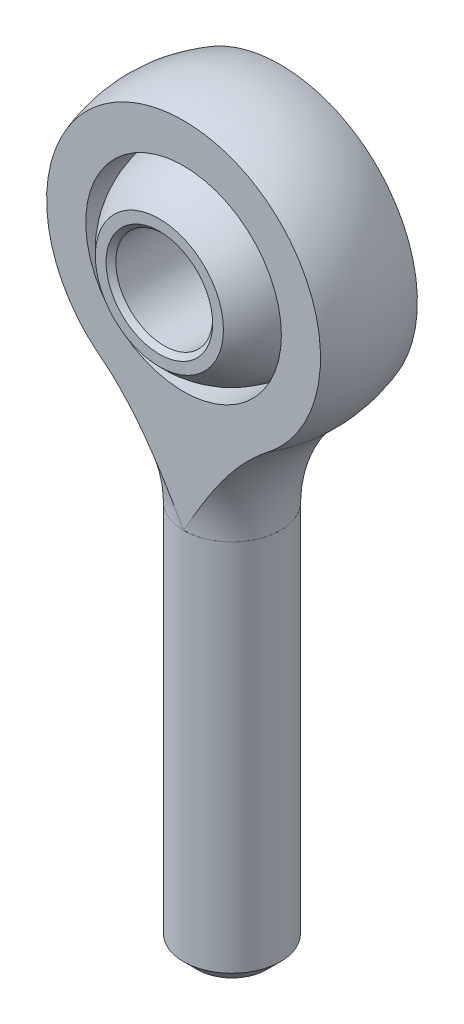
ISO-10303-21;
HEADER;
FILE_DESCRIPTION(('STEP AP214'),'2;1');
FILE_NAME('part.step','',(''),(''),'','','');
FILE_SCHEMA(('AUTOMOTIVE_DESIGN { 1 0 10303 214 1 1 1 1 }'));
ENDSEC;
DATA;
#1=APPLICATION_CONTEXT('core data for automotive mechanical design processes');
#2=APPLICATION_PROTOCOL_DEFINITION('international standard','automotive_design',2000,#1);
#3=PRODUCT_CONTEXT('',#1,'mechanical');
#4=PRODUCT('Part','Part','',(#3));
#5=PRODUCT_RELATED_PRODUCT_CATEGORY('part','',(#4));
#6=PRODUCT_DEFINITION_FORMATION('','',#4);
#7=PRODUCT_DEFINITION_CONTEXT('part definition',#1,'design');
#8=PRODUCT_DEFINITION('design','',#6,#7);
#9=PRODUCT_DEFINITION_SHAPE('','',#8);
#10=(LENGTH_UNIT() NAMED_UNIT(*) SI_UNIT(.MILLI.,.METRE.));
#11=(NAMED_UNIT(*) PLANE_ANGLE_UNIT() SI_UNIT($,.RADIAN.));
#12=(NAMED_UNIT(*) SI_UNIT($,.STERADIAN.) SOLID_ANGLE_UNIT());
#13=UNCERTAINTY_MEASURE_WITH_UNIT(LENGTH_MEASURE(1.E-05),#10,'distance_accuracy_value','');
#14=(GEOMETRIC_REPRESENTATION_CONTEXT(3) GLOBAL_UNCERTAINTY_ASSIGNED_CONTEXT((#13)) GLOBAL_UNIT_ASSIGNED_CONTEXT((#10,
#11,#12)) REPRESENTATION_CONTEXT('',''));
#15=CARTESIAN_POINT('',(0.,0.,0.));
#16=DIRECTION('',(0.,0.,1.));
#17=DIRECTION('',(1.,0.,0.));
#18=AXIS2_PLACEMENT_3D('',#15,#16,#17);
#19=CARTESIAN_POINT('',(0.,0.,0.));
#20=DIRECTION('',(0.,1.,0.));
#21=DIRECTION('',(-1.,0.,0.));
#22=AXIS2_PLACEMENT_3D('',#19,#20,#21);
#23=TOROIDAL_SURFACE('',#22,12.8984375,9.72343749999999);
#24=CARTESIAN_POINT('',(0.,0.,0.));
#25=DIRECTION('',(0.,-1.,0.));
#26=DIRECTION('',(-1.,0.,0.));
#27=AXIS2_PLACEMENT_3D('',#24,#25,#26);
#28=CIRCLE('',#27,3.175);
#29=CARTESIAN_POINT('',(0.,0.,-3.175));
#30=VERTEX_POINT('',#29);
#31=CARTESIAN_POINT('',(0.,0.,3.175));
#32=VERTEX_POINT('',#31);
#33=EDGE_CURVE('E111',#30,#32,#28,.T.);
#34=ORIENTED_EDGE('',*,*,#33,.F.);
#35=CARTESIAN_POINT('',(0.,0.,-3.175));
#36=CARTESIAN_POINT('',(0.00326153280968916,0.00570768458301649,-3.17500000000001));
#37=CARTESIAN_POINT('',(0.00652306727318909,0.0114153698475898,-3.17500000000001));
#38=CARTESIAN_POINT('',(0.273129494139749,0.477974240370057,-3.17500000000025));
#39=CARTESIAN_POINT('',(0.536560192577593,0.938786382512307,-3.17500000000008));
#40=CARTESIAN_POINT('',(1.07566265444661,1.85322785393754,-3.17499999999995));
#41=CARTESIAN_POINT('',(1.35133223121798,2.30685844682153,-3.17499999999999));
#42=CARTESIAN_POINT('',(1.92559609434366,3.19894900717051,-3.17500000000003));
#43=CARTESIAN_POINT('',(2.22416629491579,3.63742422869272,-3.17500000000001));
#44=CARTESIAN_POINT('',(2.85309895627944,4.49102276266281,-3.17500000000001));
#45=CARTESIAN_POINT('',(3.18344395161558,4.90615870726445,-3.17500000000001));
#46=CARTESIAN_POINT('',(3.77466960907839,5.58162755342156,-3.17500000000001));
#47=CARTESIAN_POINT('',(4.02585009153859,5.85044049906379,-3.17500000000001));
#48=CARTESIAN_POINT('',(4.54711374409417,6.36901465418585,-3.17500000000001));
#49=CARTESIAN_POINT('',(4.8171908835523,6.61878188917193,-3.17500000000001));
#50=CARTESIAN_POINT('',(5.37662445733852,7.09612768081782,-3.17500000000001));
#51=CARTESIAN_POINT('',(5.66599147543084,7.32369388495056,-3.17500000000001));
#52=CARTESIAN_POINT('',(6.26322715757394,7.75319037761747,-3.17500000000001));
#53=CARTESIAN_POINT('',(6.57109562036791,7.9551209449391,-3.17500000000001));
#54=CARTESIAN_POINT('',(7.20718830533395,8.33213779575581,-3.17500000000001));
#55=CARTESIAN_POINT('',(7.5355887371996,8.50692791163551,-3.17500000000001));
#56=CARTESIAN_POINT('',(8.20771747670592,8.82419193059444,-3.17500000000001));
#57=CARTESIAN_POINT('',(8.55144656910631,8.96666417686355,-3.17500000000001));
#58=CARTESIAN_POINT('',(9.25110720224452,9.21656726401781,-3.17500000000001));
#59=CARTESIAN_POINT('',(9.60702765352753,9.32402906217603,-3.17500000000001));
#60=CARTESIAN_POINT('',(10.3280020281796,9.50191139488682,-3.17500000000001));
#61=CARTESIAN_POINT('',(10.6930544047865,9.57233815850984,-3.17500000000001));
#62=CARTESIAN_POINT('',(11.3741481177771,9.66696888095835,-3.17500000000001));
#63=CARTESIAN_POINT('',(11.6894621095577,9.69646466998828,-3.17500000000001));
#64=CARTESIAN_POINT('',(12.3214131945738,9.72667494727223,-3.17500000000001));
#65=CARTESIAN_POINT('',(12.6380499892684,9.72739561225382,-3.17500000000001));
#66=CARTESIAN_POINT('',(13.2714560117432,9.69958458823448,-3.17500000000001));
#67=CARTESIAN_POINT('',(13.5882199938819,9.67092754784996,-3.17500000000001));
#68=CARTESIAN_POINT('',(14.0603016309067,9.60580647492954,-3.17500000000001));
#69=CARTESIAN_POINT('',(14.2172131664894,9.58039570302674,-3.17500000000001));
#70=CARTESIAN_POINT('',(14.5296709917936,9.52221005311135,-3.17500000000001));
#71=CARTESIAN_POINT('',(14.6852172274608,9.48943488488574,-3.17500000000001));
#72=CARTESIAN_POINT('',(14.8399244089163,9.45298870973094,-3.17500000000001));
#73=B_SPLINE_CURVE_WITH_KNOTS('',3,(#35,#36,#37,#38,#39,#40,#41,#42,#43,#44,#45,#46,#47,#48,#49,
#50,#51,#52,#53,#54,#55,#56,#57,#58,#59,#60,#61,#62,#63,#64,#65,#66,#67,#68,#69,#70,#71,#72),
.UNSPECIFIED.,.F.,.F.,(4,2,2,2,2,2,2,2,2,2,2,2,2,2,2,2,2,2,4),(0.,0.0197214984217776,
1.61208077497697,3.20415668856199,4.79458050739954,6.38413506981987,7.48699761773967,
8.58950979196063,9.69263194039796,10.7957420913582,11.9101519426933,13.0246189125353,
14.1380977461558,15.2513892393732,16.2001992986656,17.1488056899307,18.1014765941953,
18.5781908797708,19.0549239547973),.UNSPECIFIED.);
#74=CARTESIAN_POINT('',(5.53702467554139,7.21739690722648,-3.17500000000001));
#75=VERTEX_POINT('',#74);
#76=EDGE_CURVE('E96',#75,#30,#73,.F.);
#77=ORIENTED_EDGE('',*,*,#76,.F.);
#78=CARTESIAN_POINT('',(0.,7.21739690721649,0.));
#79=DIRECTION('',(0.,-1.,0.));
#80=DIRECTION('',(-1.,0.,0.));
#81=AXIS2_PLACEMENT_3D('',#78,#79,#80);
#82=CIRCLE('',#81,6.38273195876288);
#83=CARTESIAN_POINT('',(5.53702467554139,7.21739690722648,3.17500000000001));
#84=VERTEX_POINT('',#83);
#85=EDGE_CURVE('E104',#75,#84,#82,.T.);
#86=ORIENTED_EDGE('',*,*,#85,.T.);
#87=CARTESIAN_POINT('',(0.,0.,3.17500000000001));
#88=CARTESIAN_POINT('',(0.00326153280940056,0.00570768458317873,3.17500000000001));
#89=CARTESIAN_POINT('',(0.00652306727261801,0.0114153698479134,3.17500000000002));
#90=CARTESIAN_POINT('',(0.273129494115397,0.477974240381225,3.17500000000035));
#91=CARTESIAN_POINT('',(0.536560192569003,0.938786382511719,3.17500000000011));
#92=CARTESIAN_POINT('',(1.075662654448,1.853227853926,3.17499999999993));
#93=CARTESIAN_POINT('',(1.3513322312136,2.30685844681078,3.17499999999999));
#94=CARTESIAN_POINT('',(1.92559609433375,3.19894900715909,3.17500000000004));
#95=CARTESIAN_POINT('',(2.22416629490616,3.63742422867979,3.17500000000002));
#96=CARTESIAN_POINT('',(2.8530989562683,4.49102276264757,3.17500000000001));
#97=CARTESIAN_POINT('',(3.18344395160262,4.90615870724843,3.17500000000001));
#98=CARTESIAN_POINT('',(3.77466960906392,5.58162755340587,3.17500000000001));
#99=CARTESIAN_POINT('',(4.02585009152447,5.85044049904912,3.17500000000001));
#100=CARTESIAN_POINT('',(4.54711374408077,6.36901465417316,3.17500000000001));
#101=CARTESIAN_POINT('',(4.81719088353926,6.61878188916022,3.17500000000001));
#102=CARTESIAN_POINT('',(5.37662445732568,7.09612768080745,3.17500000000001));
#103=CARTESIAN_POINT('',(5.6659914754178,7.32369388494061,3.17500000000001));
#104=CARTESIAN_POINT('',(6.26322715756046,7.75319037760835,3.17500000000001));
#105=CARTESIAN_POINT('',(6.57109562035419,7.9551209449304,3.17500000000001));
#106=CARTESIAN_POINT('',(7.20718830531996,8.33213779574809,3.17500000000001));
#107=CARTESIAN_POINT('',(7.53558873718559,8.50692791162835,3.17500000000001));
#108=CARTESIAN_POINT('',(8.20771747669195,8.8241919305884,3.17500000000001));
#109=CARTESIAN_POINT('',(8.55144656909241,8.96666417685807,3.17500000000001));
#110=CARTESIAN_POINT('',(9.25110720223131,9.21656726401361,3.17500000000001));
#111=CARTESIAN_POINT('',(9.60702765351498,9.3240290621725,3.17500000000001));
#112=CARTESIAN_POINT('',(10.3280020281684,9.50191139488449,3.17500000000001));
#113=CARTESIAN_POINT('',(10.6930544047761,9.57233815850804,3.17500000000001));
#114=CARTESIAN_POINT('',(11.3741481177677,9.66696888095735,3.17500000000001));
#115=CARTESIAN_POINT('',(11.6894621095488,9.69646466998759,3.17500000000001));
#116=CARTESIAN_POINT('',(12.3214131945657,9.72667494727211,3.17500000000001));
#117=CARTESIAN_POINT('',(12.6380499892607,9.72739561225393,3.17500000000001));
#118=CARTESIAN_POINT('',(13.2714560117358,9.69958458823502,3.17500000000001));
#119=CARTESIAN_POINT('',(13.5882199938743,9.67092754785076,3.17500000000001));
#120=CARTESIAN_POINT('',(14.060301630899,9.60580647493072,3.17500000000001));
#121=CARTESIAN_POINT('',(14.2172131664817,9.58039570302806,3.17500000000001));
#122=CARTESIAN_POINT('',(14.5296709917857,9.52221005311295,3.17500000000001));
#123=CARTESIAN_POINT('',(14.6852172274529,9.48943488488747,3.17500000000001));
#124=CARTESIAN_POINT('',(14.8399244089083,9.45298870973282,3.17500000000001));
#125=B_SPLINE_CURVE_WITH_KNOTS('',3,(#87,#88,#89,#90,#91,#92,#93,#94,#95,#96,#97,#98,#99,#100,
#101,#102,#103,#104,#105,#106,#107,#108,#109,#110,#111,#112,#113,#114,#115,#116,#117,#118,#119,
#120,#121,#122,#123,#124),.UNSPECIFIED.,.F.,.F.,(4,2,2,2,2,2,2,2,2,2,2,2,2,2,2,2,2,2,4),(0.,
0.0197214984217776,1.61208077496982,3.20415668854832,4.79458050738229,6.3841350697976,
7.48699761772031,8.58950979194405,9.69263194038169,10.795742091342,11.9101519426778,
13.0246189125206,14.1380977461436,15.2513892393634,16.2001992986571,17.1488056899235,
18.1014765941876,18.5781908797629,19.0549239547892),.UNSPECIFIED.);
#126=EDGE_CURVE('E12',#32,#84,#125,.T.);
#127=ORIENTED_EDGE('',*,*,#126,.F.);
#128=EDGE_LOOP('',(#34,#77,#86,#127));
#129=FACE_BOUND('',#128,.T.);
#130=ADVANCED_FACE('F52',(#129),#23,.F.);
#131=CARTESIAN_POINT('',(0.,14.2875,0.));
#132=DIRECTION('',(0.,1.,0.));
#133=DIRECTION('',(1.,0.,0.));
#134=AXIS2_PLACEMENT_3D('',#131,#132,#133);
#135=SPHERICAL_SURFACE('',#134,9.525);
#136=ORIENTED_EDGE('',*,*,#85,.F.);
#137=CARTESIAN_POINT('',(0.,14.2875,-3.175));
#138=DIRECTION('',(0.,0.,-1.));
#139=DIRECTION('',(0.,1.,0.));
#140=AXIS2_PLACEMENT_3D('',#137,#138,#139);
#141=CIRCLE('',#140,8.98025612106915);
#142=CARTESIAN_POINT('',(-5.53702467554139,7.21739690722648,-3.17500000000001));
#143=VERTEX_POINT('',#142);
#144=EDGE_CURVE('E92',#143,#75,#141,.T.);
#145=ORIENTED_EDGE('',*,*,#144,.F.);
#146=CARTESIAN_POINT('',(-5.53702467554139,7.21739690722647,3.17500000000001));
#147=VERTEX_POINT('',#146);
#148=EDGE_CURVE('E108',#147,#143,#82,.T.);
#149=ORIENTED_EDGE('',*,*,#148,.F.);
#150=CARTESIAN_POINT('',(0.,14.2875,3.175));
#151=DIRECTION('',(0.,0.,1.));
#152=DIRECTION('',(0.,-1.,0.));
#153=AXIS2_PLACEMENT_3D('',#150,#151,#152);
#154=CIRCLE('',#153,8.98025612106915);
#155=EDGE_CURVE('E100',#84,#147,#154,.T.);
#156=ORIENTED_EDGE('',*,*,#155,.F.);
#157=EDGE_LOOP('',(#136,#145,#149,#156));
#158=FACE_BOUND('',#157,.T.);
#159=ADVANCED_FACE('F54',(#158),#135,.T.);
#160=CARTESIAN_POINT('',(3.175,0.,0.));
#161=DIRECTION('',(0.,1.,0.));
#162=DIRECTION('',(-1.,0.,0.));
#163=AXIS2_PLACEMENT_3D('',#160,#161,#162);
#164=PLANE('',#163);
#165=ORIENTED_EDGE('',*,*,#33,.T.);
#166=EDGE_CURVE('E107',#32,#30,#28,.T.);
#167=ORIENTED_EDGE('',*,*,#166,.T.);
#168=EDGE_LOOP('',(#165,#167));
#169=FACE_BOUND('',#168,.T.);
#170=ADVANCED_FACE('F151',(#169),#164,.F.);
#171=ORIENTED_EDGE('',*,*,#148,.T.);
#172=CARTESIAN_POINT('',(0.,0.,-3.175));
#173=CARTESIAN_POINT('',(-0.00326153280968916,0.00570768458301648,-3.17500000000001));
#174=CARTESIAN_POINT('',(-0.00652306727318909,0.0114153698475898,-3.17500000000001));
#175=CARTESIAN_POINT('',(-0.273129494139749,0.477974240370057,-3.17500000000025));
#176=CARTESIAN_POINT('',(-0.536560192577592,0.938786382512307,-3.17500000000008));
#177=CARTESIAN_POINT('',(-1.0756626544466,1.85322785393754,-3.17499999999995));
#178=CARTESIAN_POINT('',(-1.35133223121798,2.30685844682153,-3.17499999999999));
#179=CARTESIAN_POINT('',(-1.92559609434366,3.19894900717051,-3.17500000000003));
#180=CARTESIAN_POINT('',(-2.22416629491579,3.63742422869272,-3.17500000000001));
#181=CARTESIAN_POINT('',(-2.85309895627944,4.4910227626628,-3.17500000000001));
#182=CARTESIAN_POINT('',(-3.18344395161558,4.90615870726445,-3.17500000000001));
#183=CARTESIAN_POINT('',(-3.77466960907839,5.58162755342156,-3.17500000000001));
#184=CARTESIAN_POINT('',(-4.02585009153859,5.85044049906379,-3.17500000000001));
#185=CARTESIAN_POINT('',(-4.54711374409417,6.36901465418584,-3.17500000000001));
#186=CARTESIAN_POINT('',(-4.8171908835523,6.61878188917193,-3.17500000000001));
#187=CARTESIAN_POINT('',(-5.37662445733852,7.09612768081782,-3.17500000000001));
#188=CARTESIAN_POINT('',(-5.66599147543084,7.32369388495055,-3.17500000000001));
#189=CARTESIAN_POINT('',(-6.26322715757394,7.75319037761747,-3.17500000000001));
#190=CARTESIAN_POINT('',(-6.57109562036791,7.95512094493909,-3.17500000000001));
#191=CARTESIAN_POINT('',(-7.20718830533395,8.33213779575581,-3.17500000000001));
#192=CARTESIAN_POINT('',(-7.5355887371996,8.5069279116355,-3.17500000000001));
#193=CARTESIAN_POINT('',(-8.20771747670592,8.82419193059444,-3.17500000000001));
#194=CARTESIAN_POINT('',(-8.55144656910631,8.96666417686355,-3.17500000000001));
#195=CARTESIAN_POINT('',(-9.25110720224452,9.2165672640178,-3.17500000000001));
#196=CARTESIAN_POINT('',(-9.60702765352753,9.32402906217603,-3.17500000000001));
#197=CARTESIAN_POINT('',(-10.3280020281796,9.50191139488681,-3.17500000000001));
#198=CARTESIAN_POINT('',(-10.6930544047865,9.57233815850983,-3.17500000000001));
#199=CARTESIAN_POINT('',(-11.3741481177771,9.66696888095834,-3.17500000000001));
#200=CARTESIAN_POINT('',(-11.6894621095577,9.69646466998827,-3.17500000000001));
#201=CARTESIAN_POINT('',(-12.3214131945738,9.72667494727223,-3.17500000000001));
#202=CARTESIAN_POINT('',(-12.6380499892684,9.72739561225382,-3.17500000000001));
#203=CARTESIAN_POINT('',(-13.2714560117432,9.69958458823447,-3.17500000000001));
#204=CARTESIAN_POINT('',(-13.5882199938819,9.67092754784996,-3.17500000000001));
#205=CARTESIAN_POINT('',(-14.0603016309067,9.60580647492953,-3.17500000000001));
#206=CARTESIAN_POINT('',(-14.2172131664894,9.58039570302674,-3.17500000000001));
#207=CARTESIAN_POINT('',(-14.5296709917936,9.52221005311135,-3.17500000000001));
#208=CARTESIAN_POINT('',(-14.6852172274608,9.48943488488574,-3.17500000000001));
#209=CARTESIAN_POINT('',(-14.8399244089163,9.45298870973094,-3.17500000000001));
#210=B_SPLINE_CURVE_WITH_KNOTS('',3,(#172,#173,#174,#175,#176,#177,#178,#179,#180,#181,#182,
#183,#184,#185,#186,#187,#188,#189,#190,#191,#192,#193,#194,#195,#196,#197,#198,#199,#200,#201,
#202,#203,#204,#205,#206,#207,#208,#209),.UNSPECIFIED.,.F.,.F.,(4,2,2,2,2,2,2,2,2,2,2,2,2,2,2,2,
2,2,4),(0.,0.0197214984217776,1.61208077497697,3.20415668856199,4.79458050739953,
6.38413506981987,7.48699761773967,8.58950979196062,9.69263194039796,10.7957420913582,
11.9101519426932,13.0246189125353,14.1380977461558,15.2513892393732,16.2001992986656,
17.1488056899307,18.1014765941953,18.5781908797708,19.0549239547973),.UNSPECIFIED.);
#211=EDGE_CURVE('E78',#30,#143,#210,.T.);
#212=ORIENTED_EDGE('',*,*,#211,.F.);
#213=ORIENTED_EDGE('',*,*,#166,.F.);
#214=CARTESIAN_POINT('',(0.,0.,3.17500000000001));
#215=CARTESIAN_POINT('',(-0.00326153280940057,0.00570768458317873,3.17500000000001));
#216=CARTESIAN_POINT('',(-0.00652306727261801,0.0114153698479134,3.17500000000002));
#217=CARTESIAN_POINT('',(-0.273129494115397,0.477974240381225,3.17500000000035));
#218=CARTESIAN_POINT('',(-0.536560192569003,0.938786382511719,3.17500000000011));
#219=CARTESIAN_POINT('',(-1.075662654448,1.853227853926,3.17499999999993));
#220=CARTESIAN_POINT('',(-1.3513322312136,2.30685844681079,3.17499999999999));
#221=CARTESIAN_POINT('',(-1.92559609433375,3.19894900715908,3.17500000000004));
#222=CARTESIAN_POINT('',(-2.22416629490617,3.63742422867979,3.17500000000002));
#223=CARTESIAN_POINT('',(-2.8530989562683,4.49102276264757,3.17500000000001));
#224=CARTESIAN_POINT('',(-3.18344395160262,4.90615870724843,3.17500000000001));
#225=CARTESIAN_POINT('',(-3.77466960906392,5.58162755340587,3.17500000000001));
#226=CARTESIAN_POINT('',(-4.02585009152447,5.85044049904911,3.17500000000001));
#227=CARTESIAN_POINT('',(-4.54711374408077,6.36901465417315,3.17500000000001));
#228=CARTESIAN_POINT('',(-4.81719088353926,6.61878188916021,3.17500000000001));
#229=CARTESIAN_POINT('',(-5.37662445732568,7.09612768080745,3.17500000000001));
#230=CARTESIAN_POINT('',(-5.6659914754178,7.32369388494061,3.17500000000001));
#231=CARTESIAN_POINT('',(-6.26322715756046,7.75319037760835,3.17500000000001));
#232=CARTESIAN_POINT('',(-6.57109562035419,7.95512094493039,3.17500000000001));
#233=CARTESIAN_POINT('',(-7.20718830531996,8.33213779574809,3.17500000000001));
#234=CARTESIAN_POINT('',(-7.53558873718559,8.50692791162834,3.17500000000001));
#235=CARTESIAN_POINT('',(-8.20771747669196,8.8241919305884,3.17500000000001));
#236=CARTESIAN_POINT('',(-8.55144656909241,8.96666417685806,3.17500000000001));
#237=CARTESIAN_POINT('',(-9.25110720223131,9.21656726401361,3.17500000000001));
#238=CARTESIAN_POINT('',(-9.60702765351498,9.3240290621725,3.17500000000001));
#239=CARTESIAN_POINT('',(-10.3280020281684,9.50191139488449,3.17500000000001));
#240=CARTESIAN_POINT('',(-10.6930544047761,9.57233815850804,3.17500000000001));
#241=CARTESIAN_POINT('',(-11.3741481177677,9.66696888095735,3.17500000000001));
#242=CARTESIAN_POINT('',(-11.6894621095487,9.69646466998758,3.17500000000001));
#243=CARTESIAN_POINT('',(-12.3214131945657,9.7266749472721,3.17500000000001));
#244=CARTESIAN_POINT('',(-12.6380499892607,9.72739561225393,3.17500000000001));
#245=CARTESIAN_POINT('',(-13.2714560117358,9.69958458823502,3.17500000000001));
#246=CARTESIAN_POINT('',(-13.5882199938743,9.67092754785076,3.17500000000001));
#247=CARTESIAN_POINT('',(-14.060301630899,9.60580647493072,3.17500000000001));
#248=CARTESIAN_POINT('',(-14.2172131664816,9.58039570302806,3.17500000000001));
#249=CARTESIAN_POINT('',(-14.5296709917857,9.52221005311295,3.17500000000001));
#250=CARTESIAN_POINT('',(-14.6852172274529,9.48943488488747,3.17500000000001));
#251=CARTESIAN_POINT('',(-14.8399244089083,9.45298870973282,3.17500000000001));
#252=B_SPLINE_CURVE_WITH_KNOTS('',3,(#214,#215,#216,#217,#218,#219,#220,#221,#222,#223,#224,
#225,#226,#227,#228,#229,#230,#231,#232,#233,#234,#235,#236,#237,#238,#239,#240,#241,#242,#243,
#244,#245,#246,#247,#248,#249,#250,#251),.UNSPECIFIED.,.F.,.F.,(4,2,2,2,2,2,2,2,2,2,2,2,2,2,2,2,
2,2,4),(0.,0.0197214984217776,1.61208077496982,3.20415668854832,4.79458050738229,
6.3841350697976,7.48699761772031,8.58950979194404,9.69263194038169,10.795742091342,
11.9101519426778,13.0246189125206,14.1380977461436,15.2513892393634,16.2001992986571,
17.1488056899235,18.1014765941876,18.5781908797629,19.0549239547892),.UNSPECIFIED.);
#253=EDGE_CURVE('E66',#147,#32,#252,.F.);
#254=ORIENTED_EDGE('',*,*,#253,.F.);
#255=EDGE_LOOP('',(#171,#212,#213,#254));
#256=FACE_BOUND('',#255,.T.);
#257=ADVANCED_FACE('F124',(#256),#23,.F.);
#258=CARTESIAN_POINT('',(-9.525,14.2875,-3.175));
#259=DIRECTION('',(0.,0.,1.));
#260=DIRECTION('',(0.,1.,0.));
#261=AXIS2_PLACEMENT_3D('',#258,#259,#260);
#262=PLANE('',#261);
#263=CARTESIAN_POINT('',(0.,14.2875,-3.175));
#264=DIRECTION('',(0.,0.,1.));
#265=DIRECTION('',(1.,0.,0.));
#266=AXIS2_PLACEMENT_3D('',#263,#264,#265);
#267=CIRCLE('',#266,6.4135);
#268=CARTESIAN_POINT('',(6.4135,14.2875,-3.175));
#269=VERTEX_POINT('',#268);
#270=EDGE_CURVE('E160',#269,#269,#267,.T.);
#271=ORIENTED_EDGE('',*,*,#270,.T.);
#272=EDGE_LOOP('',(#271));
#273=FACE_BOUND('',#272,.T.);
#274=ORIENTED_EDGE('',*,*,#211,.T.);
#275=ORIENTED_EDGE('',*,*,#144,.T.);
#276=ORIENTED_EDGE('',*,*,#76,.T.);
#277=EDGE_LOOP('',(#274,#275,#276));
#278=FACE_BOUND('',#277,.T.);
#279=ADVANCED_FACE('F94',(#273,#278),#262,.F.);
#280=CARTESIAN_POINT('',(-9.525,14.2875,3.175));
#281=DIRECTION('',(0.,0.,-1.));
#282=DIRECTION('',(0.,-1.,0.));
#283=AXIS2_PLACEMENT_3D('',#280,#281,#282);
#284=PLANE('',#283);
#285=CARTESIAN_POINT('',(0.,14.2875,3.175));
#286=DIRECTION('',(0.,0.,1.));
#287=DIRECTION('',(1.,0.,0.));
#288=AXIS2_PLACEMENT_3D('',#285,#286,#287);
#289=CIRCLE('',#288,6.4135);
#290=CARTESIAN_POINT('',(6.4135,14.2875,3.175));
#291=VERTEX_POINT('',#290);
#292=EDGE_CURVE('E101',#291,#291,#289,.T.);
#293=ORIENTED_EDGE('',*,*,#292,.F.);
#294=EDGE_LOOP('',(#293));
#295=FACE_BOUND('',#294,.T.);
#296=ORIENTED_EDGE('',*,*,#126,.T.);
#297=ORIENTED_EDGE('',*,*,#155,.T.);
#298=ORIENTED_EDGE('',*,*,#253,.T.);
#299=EDGE_LOOP('',(#296,#297,#298));
#300=FACE_BOUND('',#299,.T.);
#301=ADVANCED_FACE('F128',(#295,#300),#284,.F.);
#302=CARTESIAN_POINT('',(0.,14.2875,3.175));
#303=DIRECTION('',(0.,0.,-1.));
#304=DIRECTION('',(1.,0.,0.));
#305=AXIS2_PLACEMENT_3D('',#302,#303,#304);
#306=CYLINDRICAL_SURFACE('',#305,6.4135);
#307=ORIENTED_EDGE('',*,*,#292,.T.);
#308=EDGE_LOOP('',(#307));
#309=FACE_BOUND('',#308,.T.);
#310=ORIENTED_EDGE('',*,*,#270,.F.);
#311=EDGE_LOOP('',(#310));
#312=FACE_BOUND('',#311,.T.);
#313=ADVANCED_FACE('F134',(#309,#312),#306,.F.);
#314=CLOSED_SHELL('',(#130,#159,#170,#257,#279,#301,#313));
#315=MANIFOLD_SOLID_BREP('B2',#314);
#316=CARTESIAN_POINT('',(0.,14.2875,0.));
#317=DIRECTION('',(0.,-1.,0.));
#318=DIRECTION('',(-1.,0.,0.));
#319=AXIS2_PLACEMENT_3D('',#316,#317,#318);
#320=SPHERICAL_SURFACE('',#319,6.35);
#321=CARTESIAN_POINT('',(0.,14.2875,0.));
#322=DIRECTION('',(0.,0.,1.));
#323=DIRECTION('',(1.,0.,0.));
#324=AXIS2_PLACEMENT_3D('',#321,#322,#323);
#325=SPHERICAL_SURFACE('',#324,6.35);
#326=CARTESIAN_POINT('',(0.,14.2875,4.7625));
#327=DIRECTION('',(0.,0.,1.));
#328=DIRECTION('',(1.,0.,0.));
#329=AXIS2_PLACEMENT_3D('',#326,#327,#328);
#330=CIRCLE('',#329,4.20013020631503);
#331=CARTESIAN_POINT('',(4.20013020631503,14.2875,4.7625));
#332=VERTEX_POINT('',#331);
#333=EDGE_CURVE('E245',#332,#332,#330,.F.);
#334=ORIENTED_EDGE('',*,*,#333,.T.);
#335=EDGE_LOOP('',(#334));
#336=FACE_BOUND('',#335,.T.);
#337=CARTESIAN_POINT('',(0.,14.2875,-4.7625));
#338=DIRECTION('',(0.,0.,1.));
#339=DIRECTION('',(1.,0.,0.));
#340=AXIS2_PLACEMENT_3D('',#337,#338,#339);
#341=CIRCLE('',#340,4.20013020631504);
#342=CARTESIAN_POINT('',(4.20013020631504,14.2875,-4.7625));
#343=VERTEX_POINT('',#342);
#344=EDGE_CURVE('E248',#343,#343,#341,.F.);
#345=ORIENTED_EDGE('',*,*,#344,.F.);
#346=EDGE_LOOP('',(#345));
#347=FACE_BOUND('',#346,.T.);
#348=ADVANCED_FACE('F225',(#336,#347),#325,.T.);
#349=CARTESIAN_POINT('',(0.,14.2875,6.35));
#350=DIRECTION('',(0.,0.,-1.));
#351=DIRECTION('',(1.,0.,0.));
#352=AXIS2_PLACEMENT_3D('',#349,#350,#351);
#353=CYLINDRICAL_SURFACE('',#352,3.175);
#354=CARTESIAN_POINT('',(0.,14.2875,4.445));
#355=DIRECTION('',(0.,0.,1.));
#356=DIRECTION('',(1.,0.,0.));
#357=AXIS2_PLACEMENT_3D('',#354,#355,#356);
#358=CIRCLE('',#357,3.175);
#359=CARTESIAN_POINT('',(3.175,14.2875,4.445));
#360=VERTEX_POINT('',#359);
#361=EDGE_CURVE('E236',#360,#360,#358,.F.);
#362=ORIENTED_EDGE('',*,*,#361,.F.);
#363=EDGE_LOOP('',(#362));
#364=FACE_BOUND('',#363,.T.);
#365=CARTESIAN_POINT('',(0.,14.2875,-4.445));
#366=DIRECTION('',(0.,0.,1.));
#367=DIRECTION('',(1.,0.,0.));
#368=AXIS2_PLACEMENT_3D('',#365,#366,#367);
#369=CIRCLE('',#368,3.175);
#370=CARTESIAN_POINT('',(3.175,14.2875,-4.445));
#371=VERTEX_POINT('',#370);
#372=EDGE_CURVE('E240',#371,#371,#369,.T.);
#373=ORIENTED_EDGE('',*,*,#372,.F.);
#374=EDGE_LOOP('',(#373));
#375=FACE_BOUND('',#374,.T.);
#376=ADVANCED_FACE('F255',(#364,#375),#353,.F.);
#377=CARTESIAN_POINT('',(0.,0.,4.7625));
#378=DIRECTION('',(0.,0.,-1.));
#379=DIRECTION('',(1.,0.,0.));
#380=AXIS2_PLACEMENT_3D('',#377,#378,#379);
#381=PLANE('',#380);
#382=CARTESIAN_POINT('',(0.,14.2875,4.7625));
#383=DIRECTION('',(0.,0.,1.));
#384=DIRECTION('',(1.,0.,0.));
#385=AXIS2_PLACEMENT_3D('',#382,#383,#384);
#386=CIRCLE('',#385,3.4925);
#387=CARTESIAN_POINT('',(3.49250000000001,14.2875,4.7625));
#388=VERTEX_POINT('',#387);
#389=EDGE_CURVE('E232',#388,#388,#386,.T.);
#390=ORIENTED_EDGE('',*,*,#389,.F.);
#391=EDGE_LOOP('',(#390));
#392=FACE_BOUND('',#391,.T.);
#393=ORIENTED_EDGE('',*,*,#333,.F.);
#394=EDGE_LOOP('',(#393));
#395=FACE_BOUND('',#394,.T.);
#396=ADVANCED_FACE('F261',(#392,#395),#381,.F.);
#397=CARTESIAN_POINT('',(0.,0.,-4.7625));
#398=DIRECTION('',(0.,0.,-1.));
#399=DIRECTION('',(1.,0.,0.));
#400=AXIS2_PLACEMENT_3D('',#397,#398,#399);
#401=PLANE('',#400);
#402=CARTESIAN_POINT('',(0.,14.2875,-4.7625));
#403=DIRECTION('',(0.,0.,1.));
#404=DIRECTION('',(1.,0.,0.));
#405=AXIS2_PLACEMENT_3D('',#402,#403,#404);
#406=CIRCLE('',#405,3.4925);
#407=CARTESIAN_POINT('',(3.4925,14.2875,-4.7625));
#408=VERTEX_POINT('',#407);
#409=EDGE_CURVE('E51',#408,#408,#406,.F.);
#410=ORIENTED_EDGE('',*,*,#409,.F.);
#411=EDGE_LOOP('',(#410));
#412=FACE_BOUND('',#411,.T.);
#413=ORIENTED_EDGE('',*,*,#344,.T.);
#414=EDGE_LOOP('',(#413));
#415=FACE_BOUND('',#414,.T.);
#416=ADVANCED_FACE('F252',(#412,#415),#401,.T.);
#417=CARTESIAN_POINT('',(0.,14.2875,4.445));
#418=DIRECTION('',(0.,0.,1.));
#419=DIRECTION('',(-1.,0.,0.));
#420=AXIS2_PLACEMENT_3D('',#417,#418,#419);
#421=CONICAL_SURFACE('',#420,3.175,0.785398163397453);
#422=ORIENTED_EDGE('',*,*,#389,.T.);
#423=EDGE_LOOP('',(#422));
#424=FACE_BOUND('',#423,.T.);
#425=ORIENTED_EDGE('',*,*,#361,.T.);
#426=EDGE_LOOP('',(#425));
#427=FACE_BOUND('',#426,.T.);
#428=ADVANCED_FACE('F265',(#424,#427),#421,.F.);
#429=CARTESIAN_POINT('',(0.,14.2875,-4.7625));
#430=DIRECTION('',(0.,0.,-1.));
#431=DIRECTION('',(1.,0.,0.));
#432=AXIS2_PLACEMENT_3D('',#429,#430,#431);
#433=CONICAL_SURFACE('',#432,3.4925,0.785398163397446);
#434=ORIENTED_EDGE('',*,*,#372,.T.);
#435=EDGE_LOOP('',(#434));
#436=FACE_BOUND('',#435,.T.);
#437=ORIENTED_EDGE('',*,*,#409,.T.);
#438=EDGE_LOOP('',(#437));
#439=FACE_BOUND('',#438,.T.);
#440=ADVANCED_FACE('F227',(#436,#439),#433,.F.);
#441=CLOSED_SHELL('',(#348,#376,#396,#416,#428,#440));
#442=MANIFOLD_SOLID_BREP('B6',#441);
#443=CARTESIAN_POINT('',(3.175,0.,0.));
#444=DIRECTION('',(0.,-1.,0.));
#445=DIRECTION('',(1.,0.,0.));
#446=AXIS2_PLACEMENT_3D('',#443,#444,#445);
#447=PLANE('',#446);
#448=CARTESIAN_POINT('',(0.,0.,0.));
#449=DIRECTION('',(0.,-1.,0.));
#450=DIRECTION('',(-1.,0.,0.));
#451=AXIS2_PLACEMENT_3D('',#448,#449,#450);
#452=CIRCLE('',#451,3.175);
#453=CARTESIAN_POINT('',(-3.175,0.,0.));
#454=VERTEX_POINT('',#453);
#455=EDGE_CURVE('E328',#454,#454,#452,.T.);
#456=ORIENTED_EDGE('',*,*,#455,.F.);
#457=EDGE_LOOP('',(#456));
#458=FACE_BOUND('',#457,.T.);
#459=ADVANCED_FACE('F317',(#458),#447,.F.);
#460=CARTESIAN_POINT('',(0.,-25.4,0.));
#461=DIRECTION('',(0.,1.,0.));
#462=DIRECTION('',(-1.,0.,0.));
#463=AXIS2_PLACEMENT_3D('',#460,#461,#462);
#464=PLANE('',#463);
#465=CARTESIAN_POINT('',(0.,-25.4,0.));
#466=DIRECTION('',(0.,-1.,0.));
#467=DIRECTION('',(-1.,0.,0.));
#468=AXIS2_PLACEMENT_3D('',#465,#466,#467);
#469=CIRCLE('',#468,2.26821999999999);
#470=CARTESIAN_POINT('',(-2.26821999999999,-25.4,0.));
#471=VERTEX_POINT('',#470);
#472=EDGE_CURVE('E224',#471,#471,#469,.F.);
#473=ORIENTED_EDGE('',*,*,#472,.F.);
#474=EDGE_LOOP('',(#473));
#475=FACE_BOUND('',#474,.T.);
#476=ADVANCED_FACE('F338',(#475),#464,.F.);
#477=CARTESIAN_POINT('',(0.,0.,0.));
#478=DIRECTION('',(0.,1.,0.));
#479=DIRECTION('',(-1.,0.,0.));
#480=AXIS2_PLACEMENT_3D('',#477,#478,#479);
#481=CYLINDRICAL_SURFACE('',#480,3.175);
#482=CARTESIAN_POINT('',(0.,-24.49322,0.));
#483=DIRECTION('',(0.,-1.,0.));
#484=DIRECTION('',(-1.,0.,0.));
#485=AXIS2_PLACEMENT_3D('',#482,#483,#484);
#486=CIRCLE('',#485,3.175);
#487=CARTESIAN_POINT('',(-3.17499999999999,-24.49322,0.));
#488=VERTEX_POINT('',#487);
#489=EDGE_CURVE('E324',#488,#488,#486,.T.);
#490=ORIENTED_EDGE('',*,*,#489,.F.);
#491=EDGE_LOOP('',(#490));
#492=FACE_BOUND('',#491,.T.);
#493=ORIENTED_EDGE('',*,*,#455,.T.);
#494=EDGE_LOOP('',(#493));
#495=FACE_BOUND('',#494,.T.);
#496=ADVANCED_FACE('F335',(#492,#495),#481,.T.);
#497=CARTESIAN_POINT('',(0.,-24.49322,0.));
#498=DIRECTION('',(0.,1.,0.));
#499=DIRECTION('',(-1.,0.,0.));
#500=AXIS2_PLACEMENT_3D('',#497,#498,#499);
#501=CONICAL_SURFACE('',#500,3.175,0.78539816339745);
#502=CARTESIAN_POINT('',(-2.26821999999999,-25.4,0.));
#503=CARTESIAN_POINT('',(-2.27766562499999,-25.390554375,0.));
#504=CARTESIAN_POINT('',(-2.28711124999999,-25.38110875,0.));
#505=CARTESIAN_POINT('',(-2.30600249999999,-25.3622175,0.));
#506=CARTESIAN_POINT('',(-2.31544812499999,-25.352771875,0.));
#507=CARTESIAN_POINT('',(-2.33433937499999,-25.333880625,0.));
#508=CARTESIAN_POINT('',(-2.34378499999999,-25.324435,0.));
#509=CARTESIAN_POINT('',(-2.36267624999999,-25.30554375,0.));
#510=CARTESIAN_POINT('',(-2.37212187499999,-25.296098125,0.));
#511=CARTESIAN_POINT('',(-2.39101312499999,-25.277206875,0.));
#512=CARTESIAN_POINT('',(-2.40045874999999,-25.26776125,0.));
#513=CARTESIAN_POINT('',(-2.41934999999999,-25.24887,0.));
#514=CARTESIAN_POINT('',(-2.42879562499999,-25.239424375,0.));
#515=CARTESIAN_POINT('',(-2.44768687499999,-25.220533125,0.));
#516=CARTESIAN_POINT('',(-2.45713249999999,-25.2110875,0.));
#517=CARTESIAN_POINT('',(-2.47602374999999,-25.19219625,0.));
#518=CARTESIAN_POINT('',(-2.48546937499999,-25.182750625,0.));
#519=CARTESIAN_POINT('',(-2.50436062499999,-25.163859375,0.));
#520=CARTESIAN_POINT('',(-2.51380624999999,-25.15441375,0.));
#521=CARTESIAN_POINT('',(-2.53269749999999,-25.1355225,0.));
#522=CARTESIAN_POINT('',(-2.54214312499999,-25.126076875,0.));
#523=CARTESIAN_POINT('',(-2.56103437499999,-25.107185625,0.));
#524=CARTESIAN_POINT('',(-2.57047999999999,-25.09774,0.));
#525=CARTESIAN_POINT('',(-2.58937124999999,-25.07884875,0.));
#526=CARTESIAN_POINT('',(-2.59881687499999,-25.069403125,0.));
#527=CARTESIAN_POINT('',(-2.61770812499999,-25.050511875,0.));
#528=CARTESIAN_POINT('',(-2.62715374999999,-25.04106625,0.));
#529=CARTESIAN_POINT('',(-2.64604499999999,-25.022175,0.));
#530=CARTESIAN_POINT('',(-2.65549062499999,-25.012729375,0.));
#531=CARTESIAN_POINT('',(-2.67438187499999,-24.993838125,0.));
#532=CARTESIAN_POINT('',(-2.68382749999999,-24.9843925,0.));
#533=CARTESIAN_POINT('',(-2.70271874999999,-24.96550125,0.));
#534=CARTESIAN_POINT('',(-2.71216437499999,-24.956055625,0.));
#535=CARTESIAN_POINT('',(-2.73105562499999,-24.937164375,0.));
#536=CARTESIAN_POINT('',(-2.74050124999999,-24.92771875,0.));
#537=CARTESIAN_POINT('',(-2.75939249999999,-24.9088275,0.));
#538=CARTESIAN_POINT('',(-2.76883812499999,-24.899381875,0.));
#539=CARTESIAN_POINT('',(-2.78772937499999,-24.880490625,0.));
#540=CARTESIAN_POINT('',(-2.79717499999999,-24.871045,0.));
#541=CARTESIAN_POINT('',(-2.81606624999999,-24.85215375,0.));
#542=CARTESIAN_POINT('',(-2.82551187499999,-24.842708125,0.));
#543=CARTESIAN_POINT('',(-2.84440312499999,-24.823816875,0.));
#544=CARTESIAN_POINT('',(-2.85384874999999,-24.81437125,0.));
#545=CARTESIAN_POINT('',(-2.87273999999999,-24.79548,0.));
#546=CARTESIAN_POINT('',(-2.88218562499999,-24.786034375,0.));
#547=CARTESIAN_POINT('',(-2.90107687499999,-24.767143125,0.));
#548=CARTESIAN_POINT('',(-2.91052249999999,-24.7576975,0.));
#549=CARTESIAN_POINT('',(-2.92941374999999,-24.73880625,0.));
#550=CARTESIAN_POINT('',(-2.93885937499999,-24.729360625,0.));
#551=CARTESIAN_POINT('',(-2.95775062499999,-24.710469375,0.));
#552=CARTESIAN_POINT('',(-2.96719624999999,-24.70102375,0.));
#553=CARTESIAN_POINT('',(-2.98608749999999,-24.6821325,0.));
#554=CARTESIAN_POINT('',(-2.99553312499999,-24.672686875,0.));
#555=CARTESIAN_POINT('',(-3.01442437499999,-24.653795625,0.));
#556=CARTESIAN_POINT('',(-3.02386999999999,-24.64435,0.));
#557=CARTESIAN_POINT('',(-3.04276124999999,-24.62545875,0.));
#558=CARTESIAN_POINT('',(-3.05220687499999,-24.616013125,0.));
#559=CARTESIAN_POINT('',(-3.07109812499999,-24.597121875,0.));
#560=CARTESIAN_POINT('',(-3.08054374999999,-24.58767625,0.));
#561=CARTESIAN_POINT('',(-3.09943499999999,-24.568785,0.));
#562=CARTESIAN_POINT('',(-3.10888062499999,-24.559339375,0.));
#563=CARTESIAN_POINT('',(-3.12777187499999,-24.540448125,0.));
#564=CARTESIAN_POINT('',(-3.13721749999999,-24.5310025,0.));
#565=CARTESIAN_POINT('',(-3.15610874999999,-24.51211125,0.));
#566=CARTESIAN_POINT('',(-3.16555437499999,-24.502665625,0.));
#567=CARTESIAN_POINT('',(-3.17499999999999,-24.49322,0.));
#568=B_SPLINE_CURVE_WITH_KNOTS('',3,(#502,#503,#504,#505,#506,#507,#508,#509,#510,#511,#512,
#513,#514,#515,#516,#517,#518,#519,#520,#521,#522,#523,#524,#525,#526,#527,#528,#529,#530,#531,
#532,#533,#534,#535,#536,#537,#538,#539,#540,#541,#542,#543,#544,#545,#546,#547,#548,#549,#550,
#551,#552,#553,#554,#555,#556,#557,#558,#559,#560,#561,#562,#563,#564,#565,#566,#567),
.UNSPECIFIED.,.F.,.F.,(4,2,2,2,2,2,2,2,2,2,2,2,2,2,2,2,2,2,2,2,2,2,2,2,2,2,2,2,2,2,2,2,4),(0.,
0.0400743929402709,0.0801487858805421,0.120223178820813,0.160297571761084,0.200371964701355,
0.240446357641626,0.280520750581897,0.320595143522169,0.360669536462439,0.40074392940271,
0.440818322342982,0.480892715283252,0.520967108223524,0.561041501163795,0.601115894104066,
0.641190287044337,0.681264679984608,0.721339072924879,0.76141346586515,0.801487858805421,
0.841562251745692,0.881636644685963,0.921711037626234,0.961785430566505,1.00185982350678,
1.04193421644705,1.08200860938732,1.12208300232759,1.16215739526786,1.20223178820813,
1.2423061811484,1.28238057408868),.UNSPECIFIED.);
#569=EDGE_CURVE('BSEAM319',#471,#488,#568,.T.);
#570=ORIENTED_EDGE('',*,*,#472,.T.);
#571=ORIENTED_EDGE('',*,*,#489,.T.);
#572=ORIENTED_EDGE('',*,*,#569,.T.);
#573=ORIENTED_EDGE('',*,*,#569,.F.);
#574=EDGE_LOOP('',(#570,#572,#571,#573));
#575=FACE_BOUND('',#574,.T.);
#576=ADVANCED_FACE('F319',(#575),#501,.T.);
#577=CLOSED_SHELL('',(#459,#476,#496,#576));
#578=MANIFOLD_SOLID_BREP('B46',#577);
#579=ADVANCED_BREP_SHAPE_REPRESENTATION('',(#18,#315,#442,#578),#14);
#580=SHAPE_DEFINITION_REPRESENTATION(#9,#579);
ENDSEC;
END-ISO-10303-21;
